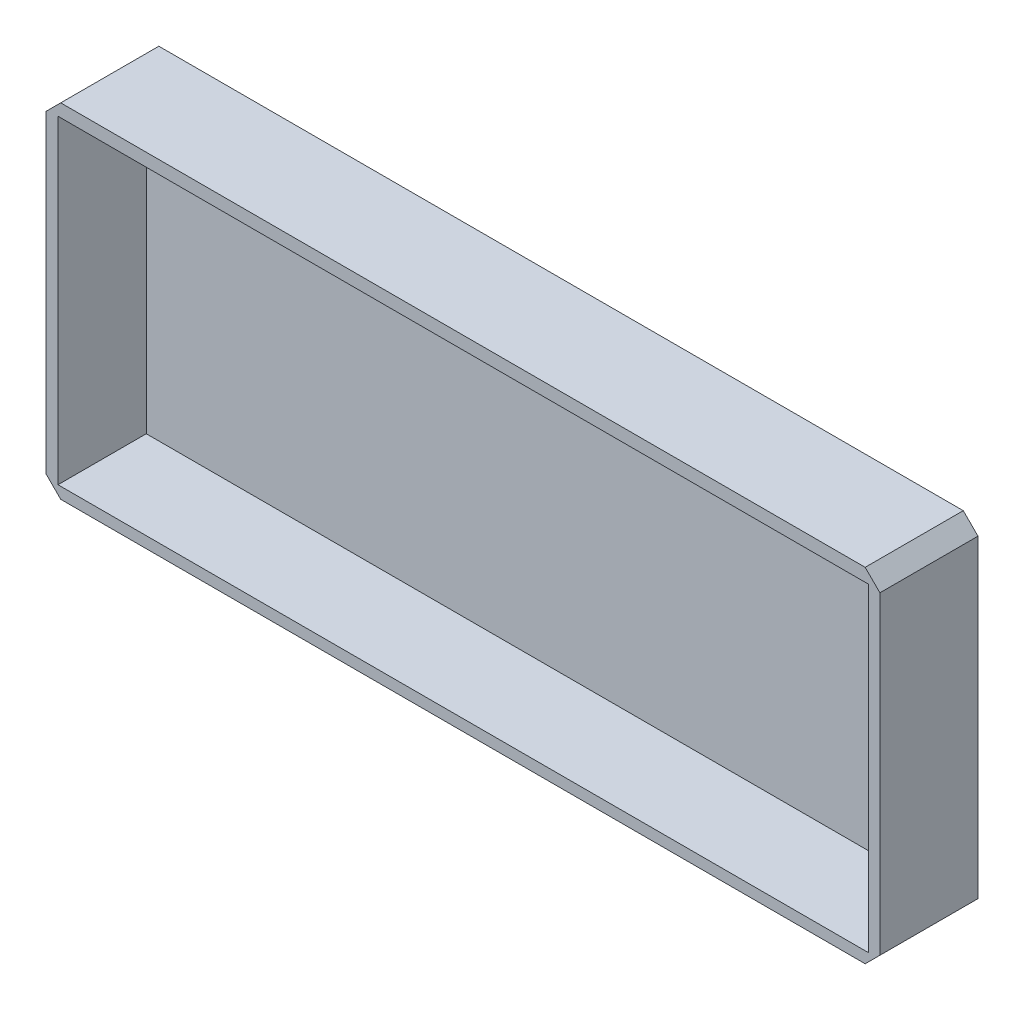
ISO-10303-21;
HEADER;
FILE_DESCRIPTION(('STEP AP214'),'2;1');
FILE_NAME('part.step','',(''),(''),'','','');
FILE_SCHEMA(('AUTOMOTIVE_DESIGN { 1 0 10303 214 1 1 1 1 }'));
ENDSEC;
DATA;
#1=APPLICATION_CONTEXT('core data for automotive mechanical design processes');
#2=APPLICATION_PROTOCOL_DEFINITION('international standard','automotive_design',2000,#1);
#3=PRODUCT_CONTEXT('',#1,'mechanical');
#4=PRODUCT('Part','Part','',(#3));
#5=PRODUCT_RELATED_PRODUCT_CATEGORY('part','',(#4));
#6=PRODUCT_DEFINITION_FORMATION('','',#4);
#7=PRODUCT_DEFINITION_CONTEXT('part definition',#1,'design');
#8=PRODUCT_DEFINITION('design','',#6,#7);
#9=PRODUCT_DEFINITION_SHAPE('','',#8);
#10=(LENGTH_UNIT() NAMED_UNIT(*) SI_UNIT(.MILLI.,.METRE.));
#11=(NAMED_UNIT(*) PLANE_ANGLE_UNIT() SI_UNIT($,.RADIAN.));
#12=(NAMED_UNIT(*) SI_UNIT($,.STERADIAN.) SOLID_ANGLE_UNIT());
#13=UNCERTAINTY_MEASURE_WITH_UNIT(LENGTH_MEASURE(1.E-05),#10,'distance_accuracy_value','');
#14=(GEOMETRIC_REPRESENTATION_CONTEXT(3) GLOBAL_UNCERTAINTY_ASSIGNED_CONTEXT((#13)) GLOBAL_UNIT_ASSIGNED_CONTEXT((#10,
#11,#12)) REPRESENTATION_CONTEXT('',''));
#15=CARTESIAN_POINT('',(0.,0.,0.));
#16=DIRECTION('',(0.,0.,1.));
#17=DIRECTION('',(1.,0.,0.));
#18=AXIS2_PLACEMENT_3D('',#15,#16,#17);
#19=CARTESIAN_POINT('',(0.,0.,20.));
#20=DIRECTION('',(1.,0.,0.));
#21=DIRECTION('',(0.,1.,0.));
#22=AXIS2_PLACEMENT_3D('',#19,#20,#21);
#23=PLANE('',#22);
#24=DIRECTION('',(0.,-1.,0.));
#25=VECTOR('',#24,1.);
#26=CARTESIAN_POINT('',(0.,0.,20.));
#27=LINE('',#26,#25);
#28=CARTESIAN_POINT('',(0.,-3.,20.));
#29=VERTEX_POINT('',#28);
#30=CARTESIAN_POINT('',(0.,-67.,20.));
#31=VERTEX_POINT('',#30);
#32=EDGE_CURVE('E167',#29,#31,#27,.T.);
#33=ORIENTED_EDGE('',*,*,#32,.F.);
#34=DIRECTION('',(0.,0.,-1.));
#35=VECTOR('',#34,1.);
#36=CARTESIAN_POINT('',(0.,-3.,20.));
#37=LINE('',#36,#35);
#38=CARTESIAN_POINT('',(0.,-3.,0.));
#39=VERTEX_POINT('',#38);
#40=EDGE_CURVE('E11',#29,#39,#37,.T.);
#41=ORIENTED_EDGE('',*,*,#40,.T.);
#42=DIRECTION('',(0.,-1.,0.));
#43=VECTOR('',#42,1.);
#44=CARTESIAN_POINT('',(0.,0.,0.));
#45=LINE('',#44,#43);
#46=CARTESIAN_POINT('',(0.,-67.,0.));
#47=VERTEX_POINT('',#46);
#48=EDGE_CURVE('E163',#39,#47,#45,.T.);
#49=ORIENTED_EDGE('',*,*,#48,.T.);
#50=DIRECTION('',(0.,0.,1.));
#51=VECTOR('',#50,1.);
#52=CARTESIAN_POINT('',(0.,-67.,20.));
#53=LINE('',#52,#51);
#54=EDGE_CURVE('E41',#47,#31,#53,.T.);
#55=ORIENTED_EDGE('',*,*,#54,.T.);
#56=EDGE_LOOP('',(#33,#41,#49,#55));
#57=FACE_BOUND('',#56,.T.);
#58=ADVANCED_FACE('F33',(#57),#23,.F.);
#59=CARTESIAN_POINT('',(0.,-70.,20.));
#60=DIRECTION('',(0.,1.,0.));
#61=DIRECTION('',(0.,0.,1.));
#62=AXIS2_PLACEMENT_3D('',#59,#60,#61);
#63=PLANE('',#62);
#64=DIRECTION('',(1.,0.,0.));
#65=VECTOR('',#64,1.);
#66=CARTESIAN_POINT('',(0.,-70.,0.));
#67=LINE('',#66,#65);
#68=CARTESIAN_POINT('',(3.00000000000004,-70.,0.));
#69=VERTEX_POINT('',#68);
#70=CARTESIAN_POINT('',(167.,-70.,0.));
#71=VERTEX_POINT('',#70);
#72=EDGE_CURVE('E181',#69,#71,#67,.T.);
#73=ORIENTED_EDGE('',*,*,#72,.T.);
#74=DIRECTION('',(0.,0.,1.));
#75=VECTOR('',#74,1.);
#76=CARTESIAN_POINT('',(167.,-70.,20.));
#77=LINE('',#76,#75);
#78=CARTESIAN_POINT('',(167.,-70.,20.));
#79=VERTEX_POINT('',#78);
#80=EDGE_CURVE('E203',#71,#79,#77,.T.);
#81=ORIENTED_EDGE('',*,*,#80,.T.);
#82=DIRECTION('',(1.,0.,0.));
#83=VECTOR('',#82,1.);
#84=CARTESIAN_POINT('',(0.,-70.,20.));
#85=LINE('',#84,#83);
#86=CARTESIAN_POINT('',(3.00000000000004,-70.,20.));
#87=VERTEX_POINT('',#86);
#88=EDGE_CURVE('E170',#87,#79,#85,.T.);
#89=ORIENTED_EDGE('',*,*,#88,.F.);
#90=DIRECTION('',(0.,0.,-1.));
#91=VECTOR('',#90,1.);
#92=CARTESIAN_POINT('',(3.00000000000004,-70.,20.));
#93=LINE('',#92,#91);
#94=EDGE_CURVE('E200',#87,#69,#93,.T.);
#95=ORIENTED_EDGE('',*,*,#94,.T.);
#96=EDGE_LOOP('',(#73,#81,#89,#95));
#97=FACE_BOUND('',#96,.T.);
#98=ADVANCED_FACE('F228',(#97),#63,.F.);
#99=CARTESIAN_POINT('',(170.,0.,20.));
#100=DIRECTION('',(-1.,0.,0.));
#101=DIRECTION('',(0.,-1.,0.));
#102=AXIS2_PLACEMENT_3D('',#99,#100,#101);
#103=PLANE('',#102);
#104=DIRECTION('',(0.,1.,0.));
#105=VECTOR('',#104,1.);
#106=CARTESIAN_POINT('',(170.,0.,20.));
#107=LINE('',#106,#105);
#108=CARTESIAN_POINT('',(170.,-67.,20.));
#109=VERTEX_POINT('',#108);
#110=CARTESIAN_POINT('',(170.,-3.00000000000008,20.));
#111=VERTEX_POINT('',#110);
#112=EDGE_CURVE('E174',#109,#111,#107,.T.);
#113=ORIENTED_EDGE('',*,*,#112,.F.);
#114=DIRECTION('',(0.,0.,-1.));
#115=VECTOR('',#114,1.);
#116=CARTESIAN_POINT('',(170.,-67.,20.));
#117=LINE('',#116,#115);
#118=CARTESIAN_POINT('',(170.,-67.,0.));
#119=VERTEX_POINT('',#118);
#120=EDGE_CURVE('E189',#109,#119,#117,.T.);
#121=ORIENTED_EDGE('',*,*,#120,.T.);
#122=DIRECTION('',(0.,1.,0.));
#123=VECTOR('',#122,1.);
#124=CARTESIAN_POINT('',(170.,0.,0.));
#125=LINE('',#124,#123);
#126=CARTESIAN_POINT('',(170.,-3.00000000000003,0.));
#127=VERTEX_POINT('',#126);
#128=EDGE_CURVE('E184',#119,#127,#125,.T.);
#129=ORIENTED_EDGE('',*,*,#128,.T.);
#130=DIRECTION('',(0.,0.,1.));
#131=VECTOR('',#130,1.);
#132=CARTESIAN_POINT('',(170.,-3.00000000000003,20.));
#133=LINE('',#132,#131);
#134=EDGE_CURVE('E178',#127,#111,#133,.T.);
#135=ORIENTED_EDGE('',*,*,#134,.T.);
#136=EDGE_LOOP('',(#113,#121,#129,#135));
#137=FACE_BOUND('',#136,.T.);
#138=ADVANCED_FACE('F239',(#137),#103,.F.);
#139=CARTESIAN_POINT('',(0.,0.,20.));
#140=DIRECTION('',(0.,-1.,0.));
#141=DIRECTION('',(0.,0.,-1.));
#142=AXIS2_PLACEMENT_3D('',#139,#140,#141);
#143=PLANE('',#142);
#144=DIRECTION('',(-1.,0.,0.));
#145=VECTOR('',#144,1.);
#146=CARTESIAN_POINT('',(0.,0.,20.));
#147=LINE('',#146,#145);
#148=CARTESIAN_POINT('',(167.,0.,20.));
#149=VERTEX_POINT('',#148);
#150=CARTESIAN_POINT('',(3.00000000000003,0.,20.));
#151=VERTEX_POINT('',#150);
#152=EDGE_CURVE('E176',#149,#151,#147,.T.);
#153=ORIENTED_EDGE('',*,*,#152,.F.);
#154=DIRECTION('',(0.,0.,-1.));
#155=VECTOR('',#154,1.);
#156=CARTESIAN_POINT('',(167.,0.,20.));
#157=LINE('',#156,#155);
#158=CARTESIAN_POINT('',(167.,0.,0.));
#159=VERTEX_POINT('',#158);
#160=EDGE_CURVE('E213',#149,#159,#157,.T.);
#161=ORIENTED_EDGE('',*,*,#160,.T.);
#162=DIRECTION('',(-1.,0.,0.));
#163=VECTOR('',#162,1.);
#164=CARTESIAN_POINT('',(0.,0.,0.));
#165=LINE('',#164,#163);
#166=CARTESIAN_POINT('',(3.00000000000003,0.,0.));
#167=VERTEX_POINT('',#166);
#168=EDGE_CURVE('E171',#159,#167,#165,.T.);
#169=ORIENTED_EDGE('',*,*,#168,.T.);
#170=DIRECTION('',(0.,0.,1.));
#171=VECTOR('',#170,1.);
#172=CARTESIAN_POINT('',(3.00000000000003,0.,20.));
#173=LINE('',#172,#171);
#174=EDGE_CURVE('E48',#167,#151,#173,.T.);
#175=ORIENTED_EDGE('',*,*,#174,.T.);
#176=EDGE_LOOP('',(#153,#161,#169,#175));
#177=FACE_BOUND('',#176,.T.);
#178=ADVANCED_FACE('F245',(#177),#143,.F.);
#179=CARTESIAN_POINT('',(0.,0.,20.));
#180=DIRECTION('',(0.,0.,1.));
#181=DIRECTION('',(1.,0.,0.));
#182=AXIS2_PLACEMENT_3D('',#179,#180,#181);
#183=PLANE('',#182);
#184=DIRECTION('',(0.,-1.,0.));
#185=VECTOR('',#184,1.);
#186=CARTESIAN_POINT('',(2.44491045671019,-2.640443296303,20.));
#187=LINE('',#186,#185);
#188=CARTESIAN_POINT('',(2.44491045671019,-2.640443296303,20.));
#189=VERTEX_POINT('',#188);
#190=CARTESIAN_POINT('',(2.44491045671019,-67.6992895824758,20.));
#191=VERTEX_POINT('',#190);
#192=EDGE_CURVE('E131',#189,#191,#187,.T.);
#193=ORIENTED_EDGE('',*,*,#192,.F.);
#194=DIRECTION('',(-1.,0.,0.));
#195=VECTOR('',#194,1.);
#196=CARTESIAN_POINT('',(2.44491045671019,-2.640443296303,20.));
#197=LINE('',#196,#195);
#198=CARTESIAN_POINT('',(167.724955982679,-2.640443296303,20.));
#199=VERTEX_POINT('',#198);
#200=EDGE_CURVE('E148',#199,#189,#197,.T.);
#201=ORIENTED_EDGE('',*,*,#200,.F.);
#202=DIRECTION('',(0.,1.,0.));
#203=VECTOR('',#202,1.);
#204=CARTESIAN_POINT('',(167.724955982679,-2.640443296303,20.));
#205=LINE('',#204,#203);
#206=CARTESIAN_POINT('',(167.724955982679,-67.6992895824758,20.));
#207=VERTEX_POINT('',#206);
#208=EDGE_CURVE('E151',#207,#199,#205,.T.);
#209=ORIENTED_EDGE('',*,*,#208,.F.);
#210=DIRECTION('',(1.,0.,0.));
#211=VECTOR('',#210,1.);
#212=CARTESIAN_POINT('',(2.44491045671019,-67.6992895824758,20.));
#213=LINE('',#212,#211);
#214=EDGE_CURVE('E157',#191,#207,#213,.T.);
#215=ORIENTED_EDGE('',*,*,#214,.F.);
#216=EDGE_LOOP('',(#193,#201,#209,#215));
#217=FACE_BOUND('',#216,.T.);
#218=ORIENTED_EDGE('',*,*,#88,.T.);
#219=DIRECTION('',(-0.707106781186549,-0.707106781186546,0.));
#220=VECTOR('',#219,1.);
#221=CARTESIAN_POINT('',(118.5,-118.5,20.));
#222=LINE('',#221,#220);
#223=EDGE_CURVE('E210',#79,#109,#222,.F.);
#224=ORIENTED_EDGE('',*,*,#223,.T.);
#225=ORIENTED_EDGE('',*,*,#112,.T.);
#226=DIRECTION('',(0.707106781186551,-0.707106781186544,0.));
#227=VECTOR('',#226,1.);
#228=CARTESIAN_POINT('',(83.4999999999991,83.5,20.));
#229=LINE('',#228,#227);
#230=EDGE_CURVE('E55',#111,#149,#229,.F.);
#231=ORIENTED_EDGE('',*,*,#230,.T.);
#232=ORIENTED_EDGE('',*,*,#152,.T.);
#233=DIRECTION('',(0.707106781186551,0.707106781186544,0.));
#234=VECTOR('',#233,1.);
#235=CARTESIAN_POINT('',(1.5,-1.50000000000001,20.));
#236=LINE('',#235,#234);
#237=EDGE_CURVE('E207',#151,#29,#236,.F.);
#238=ORIENTED_EDGE('',*,*,#237,.T.);
#239=ORIENTED_EDGE('',*,*,#32,.T.);
#240=DIRECTION('',(-0.707106781186549,0.707106781186546,0.));
#241=VECTOR('',#240,1.);
#242=CARTESIAN_POINT('',(-33.5,-33.5000000000001,20.));
#243=LINE('',#242,#241);
#244=EDGE_CURVE('E205',#31,#87,#243,.F.);
#245=ORIENTED_EDGE('',*,*,#244,.T.);
#246=EDGE_LOOP('',(#218,#224,#225,#231,#232,#238,#239,#245));
#247=FACE_BOUND('',#246,.T.);
#248=ADVANCED_FACE('F222',(#217,#247),#183,.T.);
#249=CARTESIAN_POINT('',(0.,0.,0.));
#250=DIRECTION('',(0.,0.,1.));
#251=DIRECTION('',(1.,0.,0.));
#252=AXIS2_PLACEMENT_3D('',#249,#250,#251);
#253=PLANE('',#252);
#254=ORIENTED_EDGE('',*,*,#128,.F.);
#255=DIRECTION('',(0.707106781186549,0.707106781186546,0.));
#256=VECTOR('',#255,1.);
#257=CARTESIAN_POINT('',(170.,-67.,0.));
#258=LINE('',#257,#256);
#259=EDGE_CURVE('E198',#119,#71,#258,.F.);
#260=ORIENTED_EDGE('',*,*,#259,.T.);
#261=ORIENTED_EDGE('',*,*,#72,.F.);
#262=DIRECTION('',(0.707106781186549,-0.707106781186546,0.));
#263=VECTOR('',#262,1.);
#264=CARTESIAN_POINT('',(3.00000000000004,-70.,0.));
#265=LINE('',#264,#263);
#266=EDGE_CURVE('E192',#69,#47,#265,.F.);
#267=ORIENTED_EDGE('',*,*,#266,.T.);
#268=ORIENTED_EDGE('',*,*,#48,.F.);
#269=DIRECTION('',(-0.707106781186551,-0.707106781186544,0.));
#270=VECTOR('',#269,1.);
#271=CARTESIAN_POINT('',(0.,-3.,0.));
#272=LINE('',#271,#270);
#273=EDGE_CURVE('E194',#39,#167,#272,.F.);
#274=ORIENTED_EDGE('',*,*,#273,.T.);
#275=ORIENTED_EDGE('',*,*,#168,.F.);
#276=DIRECTION('',(-0.707106781186551,0.707106781186544,0.));
#277=VECTOR('',#276,1.);
#278=CARTESIAN_POINT('',(167.,0.,0.));
#279=LINE('',#278,#277);
#280=EDGE_CURVE('E196',#159,#127,#279,.F.);
#281=ORIENTED_EDGE('',*,*,#280,.T.);
#282=EDGE_LOOP('',(#254,#260,#261,#267,#268,#274,#275,#281));
#283=FACE_BOUND('',#282,.T.);
#284=ADVANCED_FACE('F232',(#283),#253,.F.);
#285=CARTESIAN_POINT('',(2.44491045671019,-2.640443296303,2.00000000000001));
#286=DIRECTION('',(-1.,0.,0.));
#287=DIRECTION('',(0.,0.,1.));
#288=AXIS2_PLACEMENT_3D('',#285,#286,#287);
#289=PLANE('',#288);
#290=ORIENTED_EDGE('',*,*,#192,.T.);
#291=DIRECTION('',(0.,0.,1.));
#292=VECTOR('',#291,1.);
#293=CARTESIAN_POINT('',(2.44491045671019,-67.6992895824758,2.00000000000001));
#294=LINE('',#293,#292);
#295=CARTESIAN_POINT('',(2.44491045671019,-67.6992895824758,2.00000000000001));
#296=VERTEX_POINT('',#295);
#297=EDGE_CURVE('E124',#296,#191,#294,.T.);
#298=ORIENTED_EDGE('',*,*,#297,.F.);
#299=DIRECTION('',(0.,-1.,0.));
#300=VECTOR('',#299,1.);
#301=CARTESIAN_POINT('',(2.44491045671019,-2.640443296303,2.00000000000001));
#302=LINE('',#301,#300);
#303=CARTESIAN_POINT('',(2.44491045671019,-2.640443296303,2.00000000000001));
#304=VERTEX_POINT('',#303);
#305=EDGE_CURVE('E128',#304,#296,#302,.T.);
#306=ORIENTED_EDGE('',*,*,#305,.F.);
#307=DIRECTION('',(0.,0.,1.));
#308=VECTOR('',#307,1.);
#309=CARTESIAN_POINT('',(2.44491045671019,-2.640443296303,2.00000000000001));
#310=LINE('',#309,#308);
#311=EDGE_CURVE('E161',#304,#189,#310,.T.);
#312=ORIENTED_EDGE('',*,*,#311,.T.);
#313=EDGE_LOOP('',(#290,#298,#306,#312));
#314=FACE_BOUND('',#313,.T.);
#315=ADVANCED_FACE('F126',(#314),#289,.F.);
#316=CARTESIAN_POINT('',(2.44491045671019,-2.640443296303,2.00000000000001));
#317=DIRECTION('',(0.,1.,0.));
#318=DIRECTION('',(0.,0.,1.));
#319=AXIS2_PLACEMENT_3D('',#316,#317,#318);
#320=PLANE('',#319);
#321=ORIENTED_EDGE('',*,*,#200,.T.);
#322=ORIENTED_EDGE('',*,*,#311,.F.);
#323=DIRECTION('',(-1.,0.,0.));
#324=VECTOR('',#323,1.);
#325=CARTESIAN_POINT('',(2.44491045671019,-2.640443296303,2.00000000000001));
#326=LINE('',#325,#324);
#327=CARTESIAN_POINT('',(167.724955982679,-2.640443296303,2.00000000000001));
#328=VERTEX_POINT('',#327);
#329=EDGE_CURVE('E136',#328,#304,#326,.T.);
#330=ORIENTED_EDGE('',*,*,#329,.F.);
#331=DIRECTION('',(0.,0.,1.));
#332=VECTOR('',#331,1.);
#333=CARTESIAN_POINT('',(167.724955982679,-2.640443296303,2.00000000000001));
#334=LINE('',#333,#332);
#335=EDGE_CURVE('E164',#328,#199,#334,.T.);
#336=ORIENTED_EDGE('',*,*,#335,.T.);
#337=EDGE_LOOP('',(#321,#322,#330,#336));
#338=FACE_BOUND('',#337,.T.);
#339=ADVANCED_FACE('F273',(#338),#320,.F.);
#340=CARTESIAN_POINT('',(167.724955982679,-2.640443296303,2.00000000000001));
#341=DIRECTION('',(1.,0.,0.));
#342=DIRECTION('',(0.,0.,-1.));
#343=AXIS2_PLACEMENT_3D('',#340,#341,#342);
#344=PLANE('',#343);
#345=ORIENTED_EDGE('',*,*,#208,.T.);
#346=ORIENTED_EDGE('',*,*,#335,.F.);
#347=DIRECTION('',(0.,1.,0.));
#348=VECTOR('',#347,1.);
#349=CARTESIAN_POINT('',(167.724955982679,-2.640443296303,2.00000000000001));
#350=LINE('',#349,#348);
#351=CARTESIAN_POINT('',(167.724955982679,-67.6992895824758,2.00000000000001));
#352=VERTEX_POINT('',#351);
#353=EDGE_CURVE('E144',#352,#328,#350,.T.);
#354=ORIENTED_EDGE('',*,*,#353,.F.);
#355=DIRECTION('',(0.,0.,1.));
#356=VECTOR('',#355,1.);
#357=CARTESIAN_POINT('',(167.724955982679,-67.6992895824758,2.00000000000001));
#358=LINE('',#357,#356);
#359=EDGE_CURVE('E135',#352,#207,#358,.T.);
#360=ORIENTED_EDGE('',*,*,#359,.T.);
#361=EDGE_LOOP('',(#345,#346,#354,#360));
#362=FACE_BOUND('',#361,.T.);
#363=ADVANCED_FACE('F270',(#362),#344,.F.);
#364=CARTESIAN_POINT('',(2.44491045671019,-67.6992895824758,2.00000000000001));
#365=DIRECTION('',(0.,-1.,0.));
#366=DIRECTION('',(0.,0.,-1.));
#367=AXIS2_PLACEMENT_3D('',#364,#365,#366);
#368=PLANE('',#367);
#369=ORIENTED_EDGE('',*,*,#214,.T.);
#370=ORIENTED_EDGE('',*,*,#359,.F.);
#371=DIRECTION('',(1.,0.,0.));
#372=VECTOR('',#371,1.);
#373=CARTESIAN_POINT('',(2.44491045671019,-67.6992895824758,2.00000000000001));
#374=LINE('',#373,#372);
#375=EDGE_CURVE('E139',#296,#352,#374,.T.);
#376=ORIENTED_EDGE('',*,*,#375,.F.);
#377=ORIENTED_EDGE('',*,*,#297,.T.);
#378=EDGE_LOOP('',(#369,#370,#376,#377));
#379=FACE_BOUND('',#378,.T.);
#380=ADVANCED_FACE('F140',(#379),#368,.F.);
#381=CARTESIAN_POINT('',(0.,0.,2.00000000000001));
#382=DIRECTION('',(0.,0.,1.));
#383=DIRECTION('',(1.,0.,0.));
#384=AXIS2_PLACEMENT_3D('',#381,#382,#383);
#385=PLANE('',#384);
#386=ORIENTED_EDGE('',*,*,#305,.T.);
#387=ORIENTED_EDGE('',*,*,#375,.T.);
#388=ORIENTED_EDGE('',*,*,#353,.T.);
#389=ORIENTED_EDGE('',*,*,#329,.T.);
#390=EDGE_LOOP('',(#386,#387,#388,#389));
#391=FACE_BOUND('',#390,.T.);
#392=ADVANCED_FACE('F146',(#391),#385,.T.);
#393=CARTESIAN_POINT('',(170.,-67.,20.));
#394=DIRECTION('',(-0.707106781186546,0.707106781186549,0.));
#395=DIRECTION('',(0.,0.,-1.));
#396=AXIS2_PLACEMENT_3D('',#393,#394,#395);
#397=PLANE('',#396);
#398=ORIENTED_EDGE('',*,*,#223,.F.);
#399=ORIENTED_EDGE('',*,*,#80,.F.);
#400=ORIENTED_EDGE('',*,*,#259,.F.);
#401=ORIENTED_EDGE('',*,*,#120,.F.);
#402=EDGE_LOOP('',(#398,#399,#400,#401));
#403=FACE_BOUND('',#402,.T.);
#404=ADVANCED_FACE('F236',(#403),#397,.F.);
#405=CARTESIAN_POINT('',(167.,0.,20.));
#406=DIRECTION('',(-0.707106781186544,-0.707106781186551,0.));
#407=DIRECTION('',(0.,0.,-1.));
#408=AXIS2_PLACEMENT_3D('',#405,#406,#407);
#409=PLANE('',#408);
#410=ORIENTED_EDGE('',*,*,#230,.F.);
#411=ORIENTED_EDGE('',*,*,#134,.F.);
#412=ORIENTED_EDGE('',*,*,#280,.F.);
#413=ORIENTED_EDGE('',*,*,#160,.F.);
#414=EDGE_LOOP('',(#410,#411,#412,#413));
#415=FACE_BOUND('',#414,.T.);
#416=ADVANCED_FACE('F243',(#415),#409,.F.);
#417=CARTESIAN_POINT('',(0.,-3.,20.));
#418=DIRECTION('',(0.707106781186544,-0.707106781186551,0.));
#419=DIRECTION('',(0.,0.,-1.));
#420=AXIS2_PLACEMENT_3D('',#417,#418,#419);
#421=PLANE('',#420);
#422=ORIENTED_EDGE('',*,*,#237,.F.);
#423=ORIENTED_EDGE('',*,*,#174,.F.);
#424=ORIENTED_EDGE('',*,*,#273,.F.);
#425=ORIENTED_EDGE('',*,*,#40,.F.);
#426=EDGE_LOOP('',(#422,#423,#424,#425));
#427=FACE_BOUND('',#426,.T.);
#428=ADVANCED_FACE('F247',(#427),#421,.F.);
#429=CARTESIAN_POINT('',(3.00000000000004,-70.,20.));
#430=DIRECTION('',(0.707106781186546,0.707106781186549,0.));
#431=DIRECTION('',(0.,0.,-1.));
#432=AXIS2_PLACEMENT_3D('',#429,#430,#431);
#433=PLANE('',#432);
#434=ORIENTED_EDGE('',*,*,#244,.F.);
#435=ORIENTED_EDGE('',*,*,#54,.F.);
#436=ORIENTED_EDGE('',*,*,#266,.F.);
#437=ORIENTED_EDGE('',*,*,#94,.F.);
#438=EDGE_LOOP('',(#434,#435,#436,#437));
#439=FACE_BOUND('',#438,.T.);
#440=ADVANCED_FACE('F35',(#439),#433,.F.);
#441=CLOSED_SHELL('',(#58,#98,#138,#178,#248,#284,#315,#339,#363,#380,#392,#404,#416,#428,#440));
#442=MANIFOLD_SOLID_BREP('B2',#441);
#443=ADVANCED_BREP_SHAPE_REPRESENTATION('',(#18,#442),#14);
#444=SHAPE_DEFINITION_REPRESENTATION(#9,#443);
ENDSEC;
END-ISO-10303-21;
